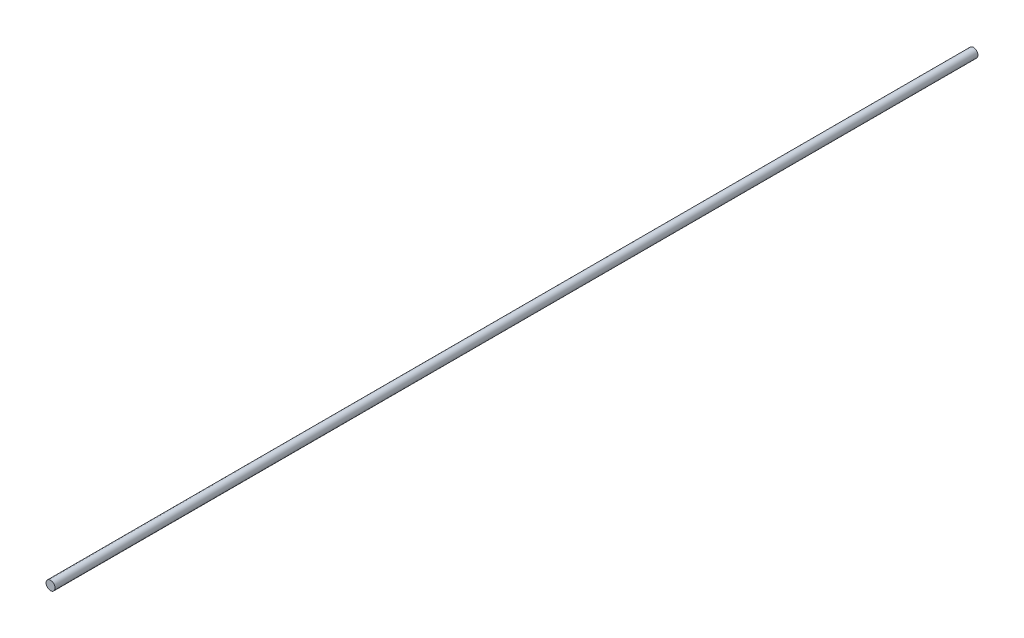
ISO-10303-21;
HEADER;
FILE_DESCRIPTION(('STEP AP214'),'2;1');
FILE_NAME('part.step','',(''),(''),'','','');
FILE_SCHEMA(('AUTOMOTIVE_DESIGN { 1 0 10303 214 1 1 1 1 }'));
ENDSEC;
DATA;
#1=APPLICATION_CONTEXT('core data for automotive mechanical design processes');
#2=APPLICATION_PROTOCOL_DEFINITION('international standard','automotive_design',2000,#1);
#3=PRODUCT_CONTEXT('',#1,'mechanical');
#4=PRODUCT('Part','Part','',(#3));
#5=PRODUCT_RELATED_PRODUCT_CATEGORY('part','',(#4));
#6=PRODUCT_DEFINITION_FORMATION('','',#4);
#7=PRODUCT_DEFINITION_CONTEXT('part definition',#1,'design');
#8=PRODUCT_DEFINITION('design','',#6,#7);
#9=PRODUCT_DEFINITION_SHAPE('','',#8);
#10=(LENGTH_UNIT() NAMED_UNIT(*) SI_UNIT(.MILLI.,.METRE.));
#11=(NAMED_UNIT(*) PLANE_ANGLE_UNIT() SI_UNIT($,.RADIAN.));
#12=(NAMED_UNIT(*) SI_UNIT($,.STERADIAN.) SOLID_ANGLE_UNIT());
#13=UNCERTAINTY_MEASURE_WITH_UNIT(LENGTH_MEASURE(1.E-05),#10,'distance_accuracy_value','');
#14=(GEOMETRIC_REPRESENTATION_CONTEXT(3) GLOBAL_UNCERTAINTY_ASSIGNED_CONTEXT((#13)) GLOBAL_UNIT_ASSIGNED_CONTEXT((#10,
#11,#12)) REPRESENTATION_CONTEXT('',''));
#15=CARTESIAN_POINT('',(0.,0.,0.));
#16=DIRECTION('',(0.,0.,1.));
#17=DIRECTION('',(1.,0.,0.));
#18=AXIS2_PLACEMENT_3D('',#15,#16,#17);
#19=CARTESIAN_POINT('',(0.,0.,205.));
#20=DIRECTION('',(0.,0.,-1.));
#21=DIRECTION('',(-1.,0.,0.));
#22=AXIS2_PLACEMENT_3D('',#19,#20,#21);
#23=CYLINDRICAL_SURFACE('',#22,1.);
#24=CARTESIAN_POINT('',(0.,0.,205.));
#25=DIRECTION('',(0.,0.,1.));
#26=DIRECTION('',(1.,0.,0.));
#27=AXIS2_PLACEMENT_3D('',#24,#25,#26);
#28=CIRCLE('',#27,1.);
#29=CARTESIAN_POINT('',(-1.,0.,205.));
#30=VERTEX_POINT('',#29);
#31=EDGE_CURVE('E10',#30,#30,#28,.T.);
#32=CARTESIAN_POINT('',(0.,0.,0.));
#33=DIRECTION('',(0.,0.,1.));
#34=DIRECTION('',(1.,0.,0.));
#35=AXIS2_PLACEMENT_3D('',#32,#33,#34);
#36=CIRCLE('',#35,1.);
#37=CARTESIAN_POINT('',(-1.,0.,0.));
#38=VERTEX_POINT('',#37);
#39=EDGE_CURVE('E38',#38,#38,#36,.T.);
#40=CARTESIAN_POINT('',(-1.,0.,205.));
#41=CARTESIAN_POINT('',(-1.,0.,202.864583333333));
#42=CARTESIAN_POINT('',(-1.,0.,200.729166666667));
#43=CARTESIAN_POINT('',(-1.,0.,196.458333333333));
#44=CARTESIAN_POINT('',(-1.,0.,194.322916666667));
#45=CARTESIAN_POINT('',(-1.,0.,190.052083333333));
#46=CARTESIAN_POINT('',(-1.,0.,187.916666666667));
#47=CARTESIAN_POINT('',(-1.,0.,183.645833333333));
#48=CARTESIAN_POINT('',(-1.,0.,181.510416666667));
#49=CARTESIAN_POINT('',(-1.,0.,177.239583333333));
#50=CARTESIAN_POINT('',(-1.,0.,175.104166666667));
#51=CARTESIAN_POINT('',(-1.,0.,170.833333333333));
#52=CARTESIAN_POINT('',(-1.,0.,168.697916666667));
#53=CARTESIAN_POINT('',(-1.,0.,164.427083333333));
#54=CARTESIAN_POINT('',(-1.,0.,162.291666666667));
#55=CARTESIAN_POINT('',(-1.,0.,158.020833333333));
#56=CARTESIAN_POINT('',(-1.,0.,155.885416666667));
#57=CARTESIAN_POINT('',(-1.,0.,151.614583333333));
#58=CARTESIAN_POINT('',(-1.,0.,149.479166666667));
#59=CARTESIAN_POINT('',(-1.,0.,145.208333333333));
#60=CARTESIAN_POINT('',(-1.,0.,143.072916666667));
#61=CARTESIAN_POINT('',(-1.,0.,138.802083333333));
#62=CARTESIAN_POINT('',(-1.,0.,136.666666666667));
#63=CARTESIAN_POINT('',(-1.,0.,132.395833333333));
#64=CARTESIAN_POINT('',(-1.,0.,130.260416666667));
#65=CARTESIAN_POINT('',(-1.,0.,125.989583333333));
#66=CARTESIAN_POINT('',(-1.,0.,123.854166666667));
#67=CARTESIAN_POINT('',(-1.,0.,119.583333333333));
#68=CARTESIAN_POINT('',(-1.,0.,117.447916666667));
#69=CARTESIAN_POINT('',(-1.,0.,113.177083333333));
#70=CARTESIAN_POINT('',(-1.,0.,111.041666666667));
#71=CARTESIAN_POINT('',(-1.,0.,106.770833333333));
#72=CARTESIAN_POINT('',(-1.,0.,104.635416666667));
#73=CARTESIAN_POINT('',(-1.,0.,100.364583333333));
#74=CARTESIAN_POINT('',(-1.,0.,98.2291666666666));
#75=CARTESIAN_POINT('',(-1.,0.,93.9583333333333));
#76=CARTESIAN_POINT('',(-1.,0.,91.8229166666666));
#77=CARTESIAN_POINT('',(-1.,0.,87.5520833333333));
#78=CARTESIAN_POINT('',(-1.,0.,85.4166666666666));
#79=CARTESIAN_POINT('',(-1.,0.,81.1458333333333));
#80=CARTESIAN_POINT('',(-1.,0.,79.0104166666667));
#81=CARTESIAN_POINT('',(-1.,0.,74.7395833333333));
#82=CARTESIAN_POINT('',(-1.,0.,72.6041666666667));
#83=CARTESIAN_POINT('',(-1.,0.,68.3333333333333));
#84=CARTESIAN_POINT('',(-1.,0.,66.1979166666667));
#85=CARTESIAN_POINT('',(-1.,0.,61.9270833333333));
#86=CARTESIAN_POINT('',(-1.,0.,59.7916666666667));
#87=CARTESIAN_POINT('',(-1.,0.,55.5208333333333));
#88=CARTESIAN_POINT('',(-1.,0.,53.3854166666667));
#89=CARTESIAN_POINT('',(-1.,0.,49.1145833333333));
#90=CARTESIAN_POINT('',(-1.,0.,46.9791666666667));
#91=CARTESIAN_POINT('',(-1.,0.,42.7083333333333));
#92=CARTESIAN_POINT('',(-1.,0.,40.5729166666667));
#93=CARTESIAN_POINT('',(-1.,0.,36.3020833333333));
#94=CARTESIAN_POINT('',(-1.,0.,34.1666666666667));
#95=CARTESIAN_POINT('',(-1.,0.,29.8958333333333));
#96=CARTESIAN_POINT('',(-1.,0.,27.7604166666667));
#97=CARTESIAN_POINT('',(-1.,0.,23.4895833333333));
#98=CARTESIAN_POINT('',(-1.,0.,21.3541666666667));
#99=CARTESIAN_POINT('',(-1.,0.,17.0833333333333));
#100=CARTESIAN_POINT('',(-1.,0.,14.9479166666667));
#101=CARTESIAN_POINT('',(-1.,0.,10.6770833333333));
#102=CARTESIAN_POINT('',(-1.,0.,8.54166666666667));
#103=CARTESIAN_POINT('',(-1.,0.,4.27083333333333));
#104=CARTESIAN_POINT('',(-1.,0.,2.13541666666667));
#105=CARTESIAN_POINT('',(-1.,0.,0.));
#106=B_SPLINE_CURVE_WITH_KNOTS('',3,(#40,#41,#42,#43,#44,#45,#46,#47,#48,#49,#50,#51,#52,#53,
#54,#55,#56,#57,#58,#59,#60,#61,#62,#63,#64,#65,#66,#67,#68,#69,#70,#71,#72,#73,#74,#75,#76,#77,
#78,#79,#80,#81,#82,#83,#84,#85,#86,#87,#88,#89,#90,#91,#92,#93,#94,#95,#96,#97,#98,#99,#100,
#101,#102,#103,#104,#105),.UNSPECIFIED.,.F.,.F.,(4,2,2,2,2,2,2,2,2,2,2,2,2,2,2,2,2,2,2,2,2,2,2,
2,2,2,2,2,2,2,2,2,4),(0.,6.40625,12.8125,19.21875,25.625,32.03125,38.4375,44.84375,51.25,
57.65625,64.0625,70.46875,76.875,83.28125,89.6875,96.09375,102.5,108.90625,115.3125,121.71875,
128.125,134.53125,140.9375,147.34375,153.75,160.15625,166.5625,172.96875,179.375,185.78125,
192.1875,198.59375,205.),.UNSPECIFIED.);
#107=EDGE_CURVE('BSEAM35',#30,#38,#106,.T.);
#108=ORIENTED_EDGE('',*,*,#31,.F.);
#109=ORIENTED_EDGE('',*,*,#39,.T.);
#110=ORIENTED_EDGE('',*,*,#107,.T.);
#111=ORIENTED_EDGE('',*,*,#107,.F.);
#112=EDGE_LOOP('',(#108,#110,#109,#111));
#113=FACE_BOUND('',#112,.T.);
#114=ADVANCED_FACE('F35',(#113),#23,.T.);
#115=CARTESIAN_POINT('',(0.,0.,205.));
#116=DIRECTION('',(0.,0.,1.));
#117=DIRECTION('',(1.,0.,0.));
#118=AXIS2_PLACEMENT_3D('',#115,#116,#117);
#119=PLANE('',#118);
#120=ORIENTED_EDGE('',*,*,#31,.T.);
#121=EDGE_LOOP('',(#120));
#122=FACE_BOUND('',#121,.T.);
#123=ADVANCED_FACE('F50',(#122),#119,.T.);
#124=CARTESIAN_POINT('',(0.,0.,0.));
#125=DIRECTION('',(0.,0.,1.));
#126=DIRECTION('',(1.,0.,0.));
#127=AXIS2_PLACEMENT_3D('',#124,#125,#126);
#128=PLANE('',#127);
#129=ORIENTED_EDGE('',*,*,#39,.F.);
#130=EDGE_LOOP('',(#129));
#131=FACE_BOUND('',#130,.T.);
#132=ADVANCED_FACE('F48',(#131),#128,.F.);
#133=CLOSED_SHELL('',(#114,#123,#132));
#134=MANIFOLD_SOLID_BREP('B2',#133);
#135=ADVANCED_BREP_SHAPE_REPRESENTATION('',(#18,#134),#14);
#136=SHAPE_DEFINITION_REPRESENTATION(#9,#135);
ENDSEC;
END-ISO-10303-21;
